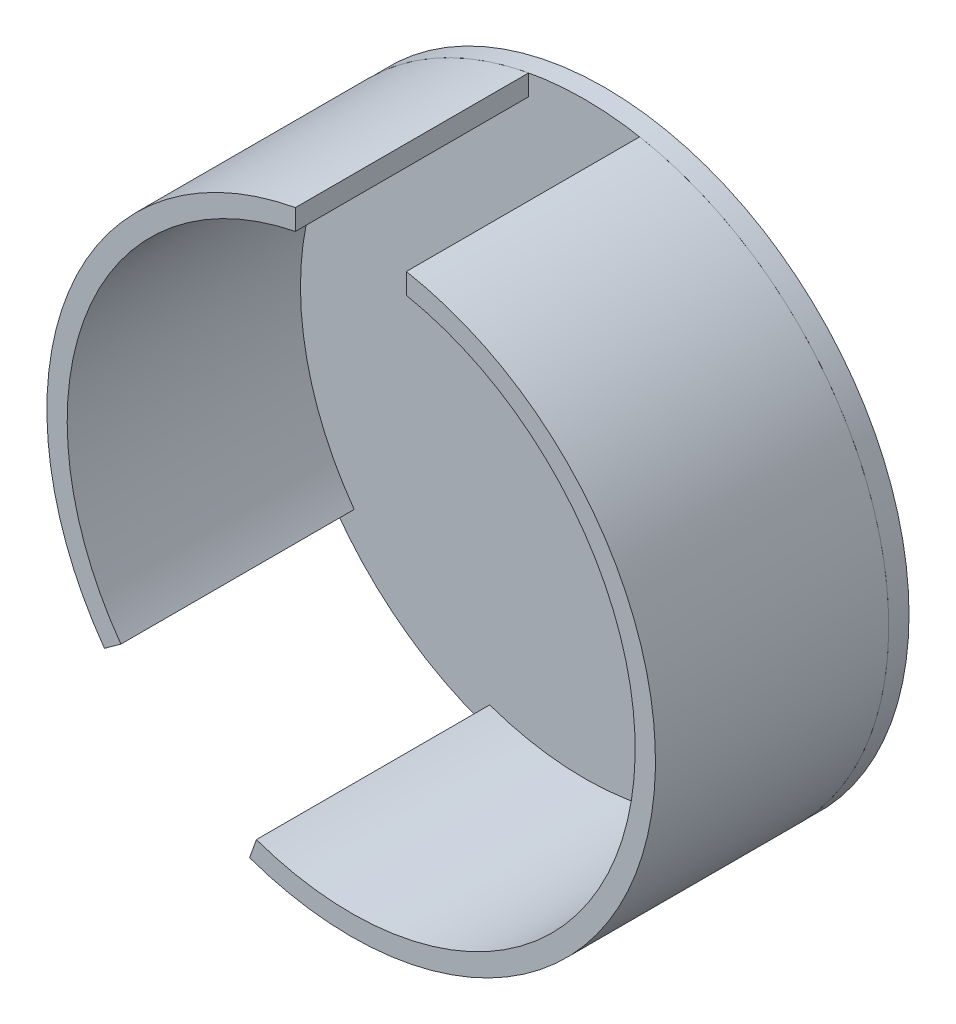
ISO-10303-21;
HEADER;
FILE_DESCRIPTION(('STEP AP214'),'2;1');
FILE_NAME('part.step','',(''),(''),'','','');
FILE_SCHEMA(('AUTOMOTIVE_DESIGN { 1 0 10303 214 1 1 1 1 }'));
ENDSEC;
DATA;
#1=APPLICATION_CONTEXT('core data for automotive mechanical design processes');
#2=APPLICATION_PROTOCOL_DEFINITION('international standard','automotive_design',2000,#1);
#3=PRODUCT_CONTEXT('',#1,'mechanical');
#4=PRODUCT('Part','Part','',(#3));
#5=PRODUCT_RELATED_PRODUCT_CATEGORY('part','',(#4));
#6=PRODUCT_DEFINITION_FORMATION('','',#4);
#7=PRODUCT_DEFINITION_CONTEXT('part definition',#1,'design');
#8=PRODUCT_DEFINITION('design','',#6,#7);
#9=PRODUCT_DEFINITION_SHAPE('','',#8);
#10=(LENGTH_UNIT() NAMED_UNIT(*) SI_UNIT(.MILLI.,.METRE.));
#11=(NAMED_UNIT(*) PLANE_ANGLE_UNIT() SI_UNIT($,.RADIAN.));
#12=(NAMED_UNIT(*) SI_UNIT($,.STERADIAN.) SOLID_ANGLE_UNIT());
#13=UNCERTAINTY_MEASURE_WITH_UNIT(LENGTH_MEASURE(1.E-05),#10,'distance_accuracy_value','');
#14=(GEOMETRIC_REPRESENTATION_CONTEXT(3) GLOBAL_UNCERTAINTY_ASSIGNED_CONTEXT((#13)) GLOBAL_UNIT_ASSIGNED_CONTEXT((#10,
#11,#12)) REPRESENTATION_CONTEXT('',''));
#15=CARTESIAN_POINT('',(0.,0.,0.));
#16=DIRECTION('',(0.,0.,1.));
#17=DIRECTION('',(1.,0.,0.));
#18=AXIS2_PLACEMENT_3D('',#15,#16,#17);
#19=CARTESIAN_POINT('',(-32.9682085133082,83.708055005863,58.002591514543));
#20=DIRECTION('',(0.,0.,-1.));
#21=DIRECTION('',(-1.,0.,0.));
#22=AXIS2_PLACEMENT_3D('',#19,#20,#21);
#23=CYLINDRICAL_SURFACE('',#22,28.);
#24=CARTESIAN_POINT('',(-32.9682085133082,83.708055005863,35.002591514543));
#25=DIRECTION('',(0.,0.,-1.));
#26=DIRECTION('',(1.,0.,0.));
#27=AXIS2_PLACEMENT_3D('',#24,#25,#26);
#28=CIRCLE('',#27,28.);
#29=CARTESIAN_POINT('',(-55.6726774433688,67.3218690370687,35.002591514543));
#30=VERTEX_POINT('',#29);
#31=CARTESIAN_POINT('',(-38.4682085133082,111.162562832448,35.002591514543));
#32=VERTEX_POINT('',#31);
#33=EDGE_CURVE('P0_E79',#30,#32,#28,.T.);
#34=ORIENTED_EDGE('',*,*,#33,.T.);
#35=DIRECTION('',(0.,0.,-1.));
#36=VECTOR('',#35,1.);
#37=CARTESIAN_POINT('',(-38.4682085133082,111.162562832448,58.002591514543));
#38=LINE('',#37,#36);
#39=CARTESIAN_POINT('',(-38.4682085133082,111.162562832448,58.002591514543));
#40=VERTEX_POINT('',#39);
#41=EDGE_CURVE('P0_E10',#40,#32,#38,.T.);
#42=ORIENTED_EDGE('',*,*,#41,.F.);
#43=CARTESIAN_POINT('',(-32.9682085133082,83.708055005863,58.002591514543));
#44=DIRECTION('',(0.,0.,-1.));
#45=DIRECTION('',(1.,0.,0.));
#46=AXIS2_PLACEMENT_3D('',#43,#44,#45);
#47=CIRCLE('',#46,28.);
#48=CARTESIAN_POINT('',(-55.6726774433688,67.3218690370687,58.002591514543));
#49=VERTEX_POINT('',#48);
#50=EDGE_CURVE('P0_E67',#49,#40,#47,.T.);
#51=ORIENTED_EDGE('',*,*,#50,.F.);
#52=DIRECTION('',(0.,0.,-1.));
#53=VECTOR('',#52,1.);
#54=CARTESIAN_POINT('',(-55.6726774433688,67.3218690370687,58.002591514543));
#55=LINE('',#54,#53);
#56=EDGE_CURVE('P0_E75',#49,#30,#55,.T.);
#57=ORIENTED_EDGE('',*,*,#56,.T.);
#58=EDGE_LOOP('',(#34,#42,#51,#57));
#59=FACE_BOUND('',#58,.T.);
#60=ADVANCED_FACE('P0_F16',(#59),#23,.F.);
#61=CARTESIAN_POINT('',(-38.4682085133082,113.19957921198,58.002591514543));
#62=DIRECTION('',(-1.,0.,0.));
#63=DIRECTION('',(0.,0.,1.));
#64=AXIS2_PLACEMENT_3D('',#61,#62,#63);
#65=PLANE('',#64);
#66=DIRECTION('',(0.,1.,0.));
#67=VECTOR('',#66,1.);
#68=CARTESIAN_POINT('',(-38.4682085133082,113.19957921198,35.002591514543));
#69=LINE('',#68,#67);
#70=CARTESIAN_POINT('',(-38.4682085133082,113.19957921198,35.002591514543));
#71=VERTEX_POINT('',#70);
#72=EDGE_CURVE('P0_E71',#32,#71,#69,.T.);
#73=ORIENTED_EDGE('',*,*,#72,.T.);
#74=DIRECTION('',(0.,0.,-1.));
#75=VECTOR('',#74,1.);
#76=CARTESIAN_POINT('',(-38.4682085133082,113.19957921198,58.002591514543));
#77=LINE('',#76,#75);
#78=CARTESIAN_POINT('',(-38.4682085133082,113.19957921198,58.002591514543));
#79=VERTEX_POINT('',#78);
#80=EDGE_CURVE('P0_E24',#79,#71,#77,.T.);
#81=ORIENTED_EDGE('',*,*,#80,.F.);
#82=DIRECTION('',(0.,1.,0.));
#83=VECTOR('',#82,1.);
#84=CARTESIAN_POINT('',(-38.4682085133082,113.19957921198,58.002591514543));
#85=LINE('',#84,#83);
#86=EDGE_CURVE('P0_E62',#40,#79,#85,.T.);
#87=ORIENTED_EDGE('',*,*,#86,.F.);
#88=ORIENTED_EDGE('',*,*,#41,.T.);
#89=EDGE_LOOP('',(#73,#81,#87,#88));
#90=FACE_BOUND('',#89,.T.);
#91=ADVANCED_FACE('P0_F70',(#90),#65,.F.);
#92=CARTESIAN_POINT('',(-32.9682085133082,83.708055005863,58.002591514543));
#93=DIRECTION('',(0.,0.,-1.));
#94=DIRECTION('',(-1.,0.,0.));
#95=AXIS2_PLACEMENT_3D('',#92,#93,#94);
#96=CYLINDRICAL_SURFACE('',#95,30.);
#97=CARTESIAN_POINT('',(-32.9682085133082,83.708055005863,35.002591514543));
#98=DIRECTION('',(0.,0.,1.));
#99=DIRECTION('',(1.,0.,0.));
#100=AXIS2_PLACEMENT_3D('',#97,#98,#99);
#101=CIRCLE('',#100,30.);
#102=CARTESIAN_POINT('',(-57.2944252240874,66.1514271821548,35.002591514543));
#103=VERTEX_POINT('',#102);
#104=EDGE_CURVE('P0_E49',#71,#103,#101,.T.);
#105=ORIENTED_EDGE('',*,*,#104,.T.);
#106=DIRECTION('',(0.,0.,-1.));
#107=VECTOR('',#106,1.);
#108=CARTESIAN_POINT('',(-57.2944252240874,66.1514271821548,58.002591514543));
#109=LINE('',#108,#107);
#110=CARTESIAN_POINT('',(-57.2944252240874,66.1514271821548,58.002591514543));
#111=VERTEX_POINT('',#110);
#112=EDGE_CURVE('P0_E72',#111,#103,#109,.T.);
#113=ORIENTED_EDGE('',*,*,#112,.F.);
#114=CARTESIAN_POINT('',(-32.9682085133082,83.708055005863,58.002591514543));
#115=DIRECTION('',(0.,0.,1.));
#116=DIRECTION('',(1.,0.,0.));
#117=AXIS2_PLACEMENT_3D('',#114,#115,#116);
#118=CIRCLE('',#117,30.);
#119=EDGE_CURVE('P0_E65',#79,#111,#118,.T.);
#120=ORIENTED_EDGE('',*,*,#119,.F.);
#121=ORIENTED_EDGE('',*,*,#80,.T.);
#122=EDGE_LOOP('',(#105,#113,#120,#121));
#123=FACE_BOUND('',#122,.T.);
#124=ADVANCED_FACE('P0_F73',(#123),#96,.T.);
#125=CARTESIAN_POINT('',(-57.2944252240874,66.1514271821548,58.002591514543));
#126=DIRECTION('',(-0.58522092745694,0.810873890359308,0.));
#127=DIRECTION('',(-0.810873890359308,-0.58522092745694,0.));
#128=AXIS2_PLACEMENT_3D('',#125,#126,#127);
#129=PLANE('',#128);
#130=DIRECTION('',(0.810873890359308,0.58522092745694,0.));
#131=VECTOR('',#130,1.);
#132=CARTESIAN_POINT('',(-57.2944252240874,66.1514271821548,35.002591514543));
#133=LINE('',#132,#131);
#134=EDGE_CURVE('P0_E55',#103,#30,#133,.T.);
#135=ORIENTED_EDGE('',*,*,#134,.T.);
#136=ORIENTED_EDGE('',*,*,#56,.F.);
#137=DIRECTION('',(0.810873890359308,0.58522092745694,0.));
#138=VECTOR('',#137,1.);
#139=CARTESIAN_POINT('',(-57.2944252240874,66.1514271821548,58.002591514543));
#140=LINE('',#139,#138);
#141=EDGE_CURVE('P0_E32',#111,#49,#140,.T.);
#142=ORIENTED_EDGE('',*,*,#141,.F.);
#143=ORIENTED_EDGE('',*,*,#112,.T.);
#144=EDGE_LOOP('',(#135,#136,#142,#143));
#145=FACE_BOUND('',#144,.T.);
#146=ADVANCED_FACE('P0_F86',(#145),#129,.F.);
#147=CARTESIAN_POINT('',(-32.9682085133082,83.708055005863,58.002591514543));
#148=DIRECTION('',(0.,0.,1.));
#149=DIRECTION('',(1.,0.,0.));
#150=AXIS2_PLACEMENT_3D('',#147,#148,#149);
#151=PLANE('',#150);
#152=ORIENTED_EDGE('',*,*,#50,.T.);
#153=ORIENTED_EDGE('',*,*,#86,.T.);
#154=ORIENTED_EDGE('',*,*,#119,.T.);
#155=ORIENTED_EDGE('',*,*,#141,.T.);
#156=EDGE_LOOP('',(#152,#153,#154,#155));
#157=FACE_BOUND('',#156,.T.);
#158=ADVANCED_FACE('P0_F63',(#157),#151,.T.);
#159=CARTESIAN_POINT('',(-32.9682085133082,83.708055005863,35.002591514543));
#160=DIRECTION('',(0.,0.,1.));
#161=DIRECTION('',(1.,0.,0.));
#162=AXIS2_PLACEMENT_3D('',#159,#160,#161);
#163=PLANE('',#162);
#164=ORIENTED_EDGE('',*,*,#33,.F.);
#165=ORIENTED_EDGE('',*,*,#134,.F.);
#166=ORIENTED_EDGE('',*,*,#104,.F.);
#167=ORIENTED_EDGE('',*,*,#72,.F.);
#168=EDGE_LOOP('',(#164,#165,#166,#167));
#169=FACE_BOUND('',#168,.T.);
#170=ADVANCED_FACE('P0_F89',(#169),#163,.F.);
#171=CLOSED_SHELL('',(#60,#91,#124,#146,#158,#170));
#172=MANIFOLD_SOLID_BREP('P0_B1',#171);
#173=CARTESIAN_POINT('',(-32.9682085133082,83.708055005863,58.002591514543));
#174=DIRECTION('',(0.,0.,-1.));
#175=DIRECTION('',(-1.,0.,0.));
#176=AXIS2_PLACEMENT_3D('',#173,#174,#175);
#177=CYLINDRICAL_SURFACE('',#176,28.);
#178=CARTESIAN_POINT('',(-32.9682085133082,83.708055005863,35.002591514543));
#179=DIRECTION('',(0.,0.,-1.));
#180=DIRECTION('',(1.,0.,0.));
#181=AXIS2_PLACEMENT_3D('',#178,#179,#180);
#182=CIRCLE('',#181,28.);
#183=CARTESIAN_POINT('',(-27.5282449084881,111.174521760403,35.002591514543));
#184=VERTEX_POINT('',#183);
#185=CARTESIAN_POINT('',(-42.3145871575244,57.3140176822753,35.002591514543));
#186=VERTEX_POINT('',#185);
#187=EDGE_CURVE('P1_E80',#184,#186,#182,.T.);
#188=ORIENTED_EDGE('',*,*,#187,.T.);
#189=DIRECTION('',(0.,0.,-1.));
#190=VECTOR('',#189,1.);
#191=CARTESIAN_POINT('',(-42.3145871575244,57.3140176822753,58.002591514543));
#192=LINE('',#191,#190);
#193=CARTESIAN_POINT('',(-42.3145871575244,57.3140176822753,58.002591514543));
#194=VERTEX_POINT('',#193);
#195=EDGE_CURVE('P1_E11',#194,#186,#192,.T.);
#196=ORIENTED_EDGE('',*,*,#195,.F.);
#197=CARTESIAN_POINT('',(-32.9682085133082,83.708055005863,58.002591514543));
#198=DIRECTION('',(0.,0.,-1.));
#199=DIRECTION('',(1.,0.,0.));
#200=AXIS2_PLACEMENT_3D('',#197,#198,#199);
#201=CIRCLE('',#200,28.);
#202=CARTESIAN_POINT('',(-27.5282449084881,111.174521760403,58.002591514543));
#203=VERTEX_POINT('',#202);
#204=EDGE_CURVE('P1_E68',#203,#194,#201,.T.);
#205=ORIENTED_EDGE('',*,*,#204,.F.);
#206=DIRECTION('',(0.,0.,-1.));
#207=VECTOR('',#206,1.);
#208=CARTESIAN_POINT('',(-27.5282449084881,111.174521760403,58.002591514543));
#209=LINE('',#208,#207);
#210=EDGE_CURVE('P1_E76',#203,#184,#209,.T.);
#211=ORIENTED_EDGE('',*,*,#210,.T.);
#212=EDGE_LOOP('',(#188,#196,#205,#211));
#213=FACE_BOUND('',#212,.T.);
#214=ADVANCED_FACE('P1_F17',(#213),#177,.F.);
#215=CARTESIAN_POINT('',(-42.3145871575244,57.3140176822753,58.002591514543));
#216=DIRECTION('',(0.942644190128132,-0.333799237293433,0.));
#217=DIRECTION('',(0.333799237293434,0.942644190128132,0.));
#218=AXIS2_PLACEMENT_3D('',#215,#216,#217);
#219=PLANE('',#218);
#220=DIRECTION('',(-0.333799237293434,-0.942644190128132,0.));
#221=VECTOR('',#220,1.);
#222=CARTESIAN_POINT('',(-42.3145871575244,57.3140176822753,35.002591514543));
#223=LINE('',#222,#221);
#224=CARTESIAN_POINT('',(-42.9821856321112,55.428729302019,35.002591514543));
#225=VERTEX_POINT('',#224);
#226=EDGE_CURVE('P1_E72',#186,#225,#223,.T.);
#227=ORIENTED_EDGE('',*,*,#226,.T.);
#228=DIRECTION('',(0.,0.,-1.));
#229=VECTOR('',#228,1.);
#230=CARTESIAN_POINT('',(-42.9821856321112,55.428729302019,58.002591514543));
#231=LINE('',#230,#229);
#232=CARTESIAN_POINT('',(-42.9821856321112,55.428729302019,58.002591514543));
#233=VERTEX_POINT('',#232);
#234=EDGE_CURVE('P1_E25',#233,#225,#231,.T.);
#235=ORIENTED_EDGE('',*,*,#234,.F.);
#236=DIRECTION('',(-0.333799237293434,-0.942644190128132,0.));
#237=VECTOR('',#236,1.);
#238=CARTESIAN_POINT('',(-42.3145871575244,57.3140176822753,58.002591514543));
#239=LINE('',#238,#237);
#240=EDGE_CURVE('P1_E63',#194,#233,#239,.T.);
#241=ORIENTED_EDGE('',*,*,#240,.F.);
#242=ORIENTED_EDGE('',*,*,#195,.T.);
#243=EDGE_LOOP('',(#227,#235,#241,#242));
#244=FACE_BOUND('',#243,.T.);
#245=ADVANCED_FACE('P1_F71',(#244),#219,.F.);
#246=CARTESIAN_POINT('',(-32.9682085133082,83.708055005863,58.002591514543));
#247=DIRECTION('',(0.,0.,-1.));
#248=DIRECTION('',(-1.,0.,0.));
#249=AXIS2_PLACEMENT_3D('',#246,#247,#248);
#250=CYLINDRICAL_SURFACE('',#249,30.);
#251=CARTESIAN_POINT('',(-32.9682085133082,83.708055005863,35.002591514543));
#252=DIRECTION('',(0.,0.,1.));
#253=DIRECTION('',(1.,0.,0.));
#254=AXIS2_PLACEMENT_3D('',#251,#252,#253);
#255=CIRCLE('',#254,30.);
#256=CARTESIAN_POINT('',(-27.5282449084881,113.210712445121,35.002591514543));
#257=VERTEX_POINT('',#256);
#258=EDGE_CURVE('P1_E50',#225,#257,#255,.T.);
#259=ORIENTED_EDGE('',*,*,#258,.T.);
#260=DIRECTION('',(0.,0.,-1.));
#261=VECTOR('',#260,1.);
#262=CARTESIAN_POINT('',(-27.5282449084881,113.210712445121,58.002591514543));
#263=LINE('',#262,#261);
#264=CARTESIAN_POINT('',(-27.5282449084881,113.210712445121,58.002591514543));
#265=VERTEX_POINT('',#264);
#266=EDGE_CURVE('P1_E73',#265,#257,#263,.T.);
#267=ORIENTED_EDGE('',*,*,#266,.F.);
#268=CARTESIAN_POINT('',(-32.9682085133082,83.708055005863,58.002591514543));
#269=DIRECTION('',(0.,0.,1.));
#270=DIRECTION('',(1.,0.,0.));
#271=AXIS2_PLACEMENT_3D('',#268,#269,#270);
#272=CIRCLE('',#271,30.);
#273=EDGE_CURVE('P1_E66',#233,#265,#272,.T.);
#274=ORIENTED_EDGE('',*,*,#273,.F.);
#275=ORIENTED_EDGE('',*,*,#234,.T.);
#276=EDGE_LOOP('',(#259,#267,#274,#275));
#277=FACE_BOUND('',#276,.T.);
#278=ADVANCED_FACE('P1_F74',(#277),#250,.T.);
#279=CARTESIAN_POINT('',(-27.5282449084881,111.174521760403,58.002591514543));
#280=DIRECTION('',(1.,0.,0.));
#281=DIRECTION('',(0.,0.,-1.));
#282=AXIS2_PLACEMENT_3D('',#279,#280,#281);
#283=PLANE('',#282);
#284=DIRECTION('',(0.,-1.,0.));
#285=VECTOR('',#284,1.);
#286=CARTESIAN_POINT('',(-27.5282449084881,111.174521760403,35.002591514543));
#287=LINE('',#286,#285);
#288=EDGE_CURVE('P1_E56',#257,#184,#287,.T.);
#289=ORIENTED_EDGE('',*,*,#288,.T.);
#290=ORIENTED_EDGE('',*,*,#210,.F.);
#291=DIRECTION('',(0.,-1.,0.));
#292=VECTOR('',#291,1.);
#293=CARTESIAN_POINT('',(-27.5282449084881,111.174521760403,58.002591514543));
#294=LINE('',#293,#292);
#295=EDGE_CURVE('P1_E33',#265,#203,#294,.T.);
#296=ORIENTED_EDGE('',*,*,#295,.F.);
#297=ORIENTED_EDGE('',*,*,#266,.T.);
#298=EDGE_LOOP('',(#289,#290,#296,#297));
#299=FACE_BOUND('',#298,.T.);
#300=ADVANCED_FACE('P1_F87',(#299),#283,.F.);
#301=CARTESIAN_POINT('',(-32.9682085133082,83.708055005863,58.002591514543));
#302=DIRECTION('',(0.,0.,1.));
#303=DIRECTION('',(1.,0.,0.));
#304=AXIS2_PLACEMENT_3D('',#301,#302,#303);
#305=PLANE('',#304);
#306=ORIENTED_EDGE('',*,*,#204,.T.);
#307=ORIENTED_EDGE('',*,*,#240,.T.);
#308=ORIENTED_EDGE('',*,*,#273,.T.);
#309=ORIENTED_EDGE('',*,*,#295,.T.);
#310=EDGE_LOOP('',(#306,#307,#308,#309));
#311=FACE_BOUND('',#310,.T.);
#312=ADVANCED_FACE('P1_F64',(#311),#305,.T.);
#313=CARTESIAN_POINT('',(-32.9682085133082,83.708055005863,35.002591514543));
#314=DIRECTION('',(0.,0.,1.));
#315=DIRECTION('',(1.,0.,0.));
#316=AXIS2_PLACEMENT_3D('',#313,#314,#315);
#317=PLANE('',#316);
#318=ORIENTED_EDGE('',*,*,#187,.F.);
#319=ORIENTED_EDGE('',*,*,#288,.F.);
#320=ORIENTED_EDGE('',*,*,#258,.F.);
#321=ORIENTED_EDGE('',*,*,#226,.F.);
#322=EDGE_LOOP('',(#318,#319,#320,#321));
#323=FACE_BOUND('',#322,.T.);
#324=ADVANCED_FACE('P1_F90',(#323),#317,.F.);
#325=CLOSED_SHELL('',(#214,#245,#278,#300,#312,#324));
#326=MANIFOLD_SOLID_BREP('P1_B1',#325);
#327=CARTESIAN_POINT('',(-32.9682085133082,83.708055005863,35.002591514543));
#328=DIRECTION('',(0.,0.,-1.));
#329=DIRECTION('',(-1.,0.,0.));
#330=AXIS2_PLACEMENT_3D('',#327,#328,#329);
#331=CYLINDRICAL_SURFACE('',#330,30.);
#332=CARTESIAN_POINT('',(-32.9682085133082,83.708055005863,35.002591514543));
#333=DIRECTION('',(0.,0.,1.));
#334=DIRECTION('',(1.,0.,0.));
#335=AXIS2_PLACEMENT_3D('',#332,#333,#334);
#336=CIRCLE('',#335,30.);
#337=CARTESIAN_POINT('',(-2.9682085133082,83.708055005863,35.002591514543));
#338=VERTEX_POINT('',#337);
#339=EDGE_CURVE('P2_E10',#338,#338,#336,.T.);
#340=ORIENTED_EDGE('',*,*,#339,.F.);
#341=EDGE_LOOP('',(#340));
#342=FACE_BOUND('',#341,.T.);
#343=CARTESIAN_POINT('',(-32.9682085133082,83.708055005863,33.002591514543));
#344=DIRECTION('',(0.,0.,1.));
#345=DIRECTION('',(1.,0.,0.));
#346=AXIS2_PLACEMENT_3D('',#343,#344,#345);
#347=CIRCLE('',#346,30.);
#348=CARTESIAN_POINT('',(-2.9682085133082,83.708055005863,33.002591514543));
#349=VERTEX_POINT('',#348);
#350=EDGE_CURVE('P2_E18',#349,#349,#347,.T.);
#351=ORIENTED_EDGE('',*,*,#350,.T.);
#352=EDGE_LOOP('',(#351));
#353=FACE_BOUND('',#352,.T.);
#354=ADVANCED_FACE('P2_F15',(#342,#353),#331,.T.);
#355=CARTESIAN_POINT('',(-32.9682085133082,83.708055005863,35.002591514543));
#356=DIRECTION('',(0.,0.,1.));
#357=DIRECTION('',(1.,0.,0.));
#358=AXIS2_PLACEMENT_3D('',#355,#356,#357);
#359=PLANE('',#358);
#360=ORIENTED_EDGE('',*,*,#339,.T.);
#361=EDGE_LOOP('',(#360));
#362=FACE_BOUND('',#361,.T.);
#363=ADVANCED_FACE('P2_F30',(#362),#359,.T.);
#364=CARTESIAN_POINT('',(-32.9682085133082,83.708055005863,33.002591514543));
#365=DIRECTION('',(0.,0.,1.));
#366=DIRECTION('',(1.,0.,0.));
#367=AXIS2_PLACEMENT_3D('',#364,#365,#366);
#368=PLANE('',#367);
#369=ORIENTED_EDGE('',*,*,#350,.F.);
#370=EDGE_LOOP('',(#369));
#371=FACE_BOUND('',#370,.T.);
#372=ADVANCED_FACE('P2_F28',(#371),#368,.F.);
#373=CLOSED_SHELL('',(#354,#363,#372));
#374=MANIFOLD_SOLID_BREP('P2_B1',#373);
#375=ADVANCED_BREP_SHAPE_REPRESENTATION('',(#18,#172,#326,#374),#14);
#376=SHAPE_DEFINITION_REPRESENTATION(#9,#375);
ENDSEC;
END-ISO-10303-21;
